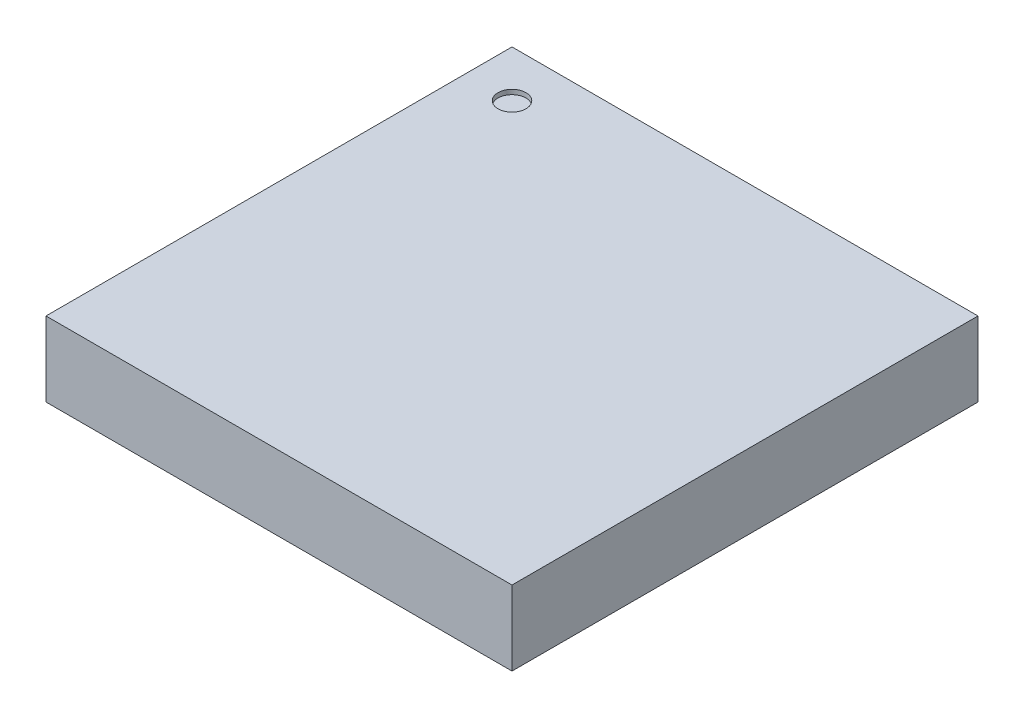
ISO-10303-21;
HEADER;
FILE_DESCRIPTION(('STEP AP214'),'2;1');
FILE_NAME('part.step','',(''),(''),'','','');
FILE_SCHEMA(('AUTOMOTIVE_DESIGN { 1 0 10303 214 1 1 1 1 }'));
ENDSEC;
DATA;
#1=APPLICATION_CONTEXT('core data for automotive mechanical design processes');
#2=APPLICATION_PROTOCOL_DEFINITION('international standard','automotive_design',2000,#1);
#3=PRODUCT_CONTEXT('',#1,'mechanical');
#4=PRODUCT('Part','Part','',(#3));
#5=PRODUCT_RELATED_PRODUCT_CATEGORY('part','',(#4));
#6=PRODUCT_DEFINITION_FORMATION('','',#4);
#7=PRODUCT_DEFINITION_CONTEXT('part definition',#1,'design');
#8=PRODUCT_DEFINITION('design','',#6,#7);
#9=PRODUCT_DEFINITION_SHAPE('','',#8);
#10=(LENGTH_UNIT() NAMED_UNIT(*) SI_UNIT(.MILLI.,.METRE.));
#11=(NAMED_UNIT(*) PLANE_ANGLE_UNIT() SI_UNIT($,.RADIAN.));
#12=(NAMED_UNIT(*) SI_UNIT($,.STERADIAN.) SOLID_ANGLE_UNIT());
#13=UNCERTAINTY_MEASURE_WITH_UNIT(LENGTH_MEASURE(1.E-05),#10,'distance_accuracy_value','');
#14=(GEOMETRIC_REPRESENTATION_CONTEXT(3) GLOBAL_UNCERTAINTY_ASSIGNED_CONTEXT((#13)) GLOBAL_UNIT_ASSIGNED_CONTEXT((#10,
#11,#12)) REPRESENTATION_CONTEXT('',''));
#15=CARTESIAN_POINT('',(0.,0.,0.));
#16=DIRECTION('',(0.,0.,1.));
#17=DIRECTION('',(1.,0.,0.));
#18=AXIS2_PLACEMENT_3D('',#15,#16,#17);
#19=CARTESIAN_POINT('',(-2.,0.8,-2.));
#20=DIRECTION('',(0.,1.,0.));
#21=DIRECTION('',(0.,0.,1.));
#22=AXIS2_PLACEMENT_3D('',#19,#20,#21);
#23=PLANE('',#22);
#24=CARTESIAN_POINT('',(-2.,0.8,-2.));
#25=DIRECTION('',(0.,1.,0.));
#26=DIRECTION('',(0.,0.,1.));
#27=AXIS2_PLACEMENT_3D('',#24,#25,#26);
#28=CIRCLE('',#27,0.15);
#29=CARTESIAN_POINT('',(-2.,0.8,-1.85));
#30=VERTEX_POINT('',#29);
#31=EDGE_CURVE('E19',#30,#30,#28,.T.);
#32=ORIENTED_EDGE('',*,*,#31,.T.);
#33=EDGE_LOOP('',(#32));
#34=FACE_BOUND('',#33,.T.);
#35=ADVANCED_FACE('F16',(#34),#23,.T.);
#36=CARTESIAN_POINT('',(-2.,0.8,-2.));
#37=DIRECTION('',(0.,1.,0.));
#38=DIRECTION('',(0.,0.,1.));
#39=AXIS2_PLACEMENT_3D('',#36,#37,#38);
#40=CYLINDRICAL_SURFACE('',#39,0.15);
#41=ORIENTED_EDGE('',*,*,#31,.F.);
#42=EDGE_LOOP('',(#41));
#43=FACE_BOUND('',#42,.T.);
#44=CARTESIAN_POINT('',(-2.,0.85,-2.));
#45=DIRECTION('',(0.,1.,0.));
#46=DIRECTION('',(0.,0.,1.));
#47=AXIS2_PLACEMENT_3D('',#44,#45,#46);
#48=CIRCLE('',#47,0.15);
#49=CARTESIAN_POINT('',(-2.,0.85,-1.85));
#50=VERTEX_POINT('',#49);
#51=EDGE_CURVE('E68',#50,#50,#48,.T.);
#52=ORIENTED_EDGE('',*,*,#51,.T.);
#53=EDGE_LOOP('',(#52));
#54=FACE_BOUND('',#53,.T.);
#55=ADVANCED_FACE('F89',(#43,#54),#40,.F.);
#56=CARTESIAN_POINT('',(2.5,0.85,-2.5));
#57=DIRECTION('',(0.,-1.,0.));
#58=DIRECTION('',(0.,0.,-1.));
#59=AXIS2_PLACEMENT_3D('',#56,#57,#58);
#60=PLANE('',#59);
#61=DIRECTION('',(-1.,0.,0.));
#62=VECTOR('',#61,1.);
#63=CARTESIAN_POINT('',(-2.5,0.85,2.5));
#64=LINE('',#63,#62);
#65=CARTESIAN_POINT('',(-2.5,0.85,2.5));
#66=VERTEX_POINT('',#65);
#67=CARTESIAN_POINT('',(2.5,0.85,2.5));
#68=VERTEX_POINT('',#67);
#69=EDGE_CURVE('E54',#66,#68,#64,.F.);
#70=ORIENTED_EDGE('',*,*,#69,.T.);
#71=DIRECTION('',(0.,0.,1.));
#72=VECTOR('',#71,1.);
#73=CARTESIAN_POINT('',(2.5,0.85,2.5));
#74=LINE('',#73,#72);
#75=CARTESIAN_POINT('',(2.5,0.85,-2.5));
#76=VERTEX_POINT('',#75);
#77=EDGE_CURVE('E59',#68,#76,#74,.F.);
#78=ORIENTED_EDGE('',*,*,#77,.T.);
#79=DIRECTION('',(1.,0.,0.));
#80=VECTOR('',#79,1.);
#81=CARTESIAN_POINT('',(-2.5,0.85,-2.5));
#82=LINE('',#81,#80);
#83=CARTESIAN_POINT('',(-2.5,0.85,-2.5));
#84=VERTEX_POINT('',#83);
#85=EDGE_CURVE('E208',#76,#84,#82,.F.);
#86=ORIENTED_EDGE('',*,*,#85,.T.);
#87=DIRECTION('',(0.,0.,-1.));
#88=VECTOR('',#87,1.);
#89=CARTESIAN_POINT('',(-2.5,0.85,2.5));
#90=LINE('',#89,#88);
#91=EDGE_CURVE('E72',#84,#66,#90,.F.);
#92=ORIENTED_EDGE('',*,*,#91,.T.);
#93=EDGE_LOOP('',(#70,#78,#86,#92));
#94=FACE_BOUND('',#93,.T.);
#95=ORIENTED_EDGE('',*,*,#51,.F.);
#96=EDGE_LOOP('',(#95));
#97=FACE_BOUND('',#96,.T.);
#98=ADVANCED_FACE('F70',(#94,#97),#60,.F.);
#99=CARTESIAN_POINT('',(2.5,0.85,2.5));
#100=DIRECTION('',(-1.,0.,0.));
#101=DIRECTION('',(0.,0.,1.));
#102=AXIS2_PLACEMENT_3D('',#99,#100,#101);
#103=PLANE('',#102);
#104=DIRECTION('',(0.,1.,0.));
#105=VECTOR('',#104,1.);
#106=CARTESIAN_POINT('',(2.5,0.85,2.5));
#107=LINE('',#106,#105);
#108=CARTESIAN_POINT('',(2.5,0.05,2.5));
#109=VERTEX_POINT('',#108);
#110=EDGE_CURVE('E61',#68,#109,#107,.F.);
#111=ORIENTED_EDGE('',*,*,#110,.T.);
#112=DIRECTION('',(0.,0.,-1.));
#113=VECTOR('',#112,1.);
#114=CARTESIAN_POINT('',(2.5,0.05,-2.5));
#115=LINE('',#114,#113);
#116=CARTESIAN_POINT('',(2.5,0.05,-2.5));
#117=VERTEX_POINT('',#116);
#118=EDGE_CURVE('E204',#117,#109,#115,.F.);
#119=ORIENTED_EDGE('',*,*,#118,.F.);
#120=DIRECTION('',(0.,1.,0.));
#121=VECTOR('',#120,1.);
#122=CARTESIAN_POINT('',(2.5,0.85,-2.5));
#123=LINE('',#122,#121);
#124=EDGE_CURVE('E64',#117,#76,#123,.T.);
#125=ORIENTED_EDGE('',*,*,#124,.T.);
#126=ORIENTED_EDGE('',*,*,#77,.F.);
#127=EDGE_LOOP('',(#111,#119,#125,#126));
#128=FACE_BOUND('',#127,.T.);
#129=ADVANCED_FACE('F60',(#128),#103,.F.);
#130=CARTESIAN_POINT('',(-2.5,0.85,2.5));
#131=DIRECTION('',(0.,0.,-1.));
#132=DIRECTION('',(-1.,0.,0.));
#133=AXIS2_PLACEMENT_3D('',#130,#131,#132);
#134=PLANE('',#133);
#135=DIRECTION('',(0.,1.,0.));
#136=VECTOR('',#135,1.);
#137=CARTESIAN_POINT('',(-2.5,0.85,2.5));
#138=LINE('',#137,#136);
#139=CARTESIAN_POINT('',(-2.5,0.05,2.5));
#140=VERTEX_POINT('',#139);
#141=EDGE_CURVE('E74',#66,#140,#138,.F.);
#142=ORIENTED_EDGE('',*,*,#141,.T.);
#143=DIRECTION('',(1.,0.,0.));
#144=VECTOR('',#143,1.);
#145=CARTESIAN_POINT('',(2.5,0.05,2.5));
#146=LINE('',#145,#144);
#147=EDGE_CURVE('E78',#109,#140,#146,.F.);
#148=ORIENTED_EDGE('',*,*,#147,.F.);
#149=ORIENTED_EDGE('',*,*,#110,.F.);
#150=ORIENTED_EDGE('',*,*,#69,.F.);
#151=EDGE_LOOP('',(#142,#148,#149,#150));
#152=FACE_BOUND('',#151,.T.);
#153=ADVANCED_FACE('F76',(#152),#134,.F.);
#154=CARTESIAN_POINT('',(-2.5,0.85,2.5));
#155=DIRECTION('',(1.,0.,0.));
#156=DIRECTION('',(0.,0.,-1.));
#157=AXIS2_PLACEMENT_3D('',#154,#155,#156);
#158=PLANE('',#157);
#159=DIRECTION('',(0.,1.,0.));
#160=VECTOR('',#159,1.);
#161=CARTESIAN_POINT('',(-2.5,0.85,-2.5));
#162=LINE('',#161,#160);
#163=CARTESIAN_POINT('',(-2.5,0.05,-2.5));
#164=VERTEX_POINT('',#163);
#165=EDGE_CURVE('E34',#84,#164,#162,.F.);
#166=ORIENTED_EDGE('',*,*,#165,.T.);
#167=DIRECTION('',(0.,0.,-1.));
#168=VECTOR('',#167,1.);
#169=CARTESIAN_POINT('',(-2.5,0.05,-2.5));
#170=LINE('',#169,#168);
#171=EDGE_CURVE('E25',#140,#164,#170,.T.);
#172=ORIENTED_EDGE('',*,*,#171,.F.);
#173=ORIENTED_EDGE('',*,*,#141,.F.);
#174=ORIENTED_EDGE('',*,*,#91,.F.);
#175=EDGE_LOOP('',(#166,#172,#173,#174));
#176=FACE_BOUND('',#175,.T.);
#177=ADVANCED_FACE('F105',(#176),#158,.F.);
#178=CARTESIAN_POINT('',(-2.5,0.85,-2.5));
#179=DIRECTION('',(0.,0.,1.));
#180=DIRECTION('',(1.,0.,0.));
#181=AXIS2_PLACEMENT_3D('',#178,#179,#180);
#182=PLANE('',#181);
#183=ORIENTED_EDGE('',*,*,#124,.F.);
#184=DIRECTION('',(1.,0.,0.));
#185=VECTOR('',#184,1.);
#186=CARTESIAN_POINT('',(2.5,0.05,-2.5));
#187=LINE('',#186,#185);
#188=EDGE_CURVE('E11',#164,#117,#187,.T.);
#189=ORIENTED_EDGE('',*,*,#188,.F.);
#190=ORIENTED_EDGE('',*,*,#165,.F.);
#191=ORIENTED_EDGE('',*,*,#85,.F.);
#192=EDGE_LOOP('',(#183,#189,#190,#191));
#193=FACE_BOUND('',#192,.T.);
#194=ADVANCED_FACE('F99',(#193),#182,.F.);
#195=CARTESIAN_POINT('',(2.5,0.05,-2.5));
#196=DIRECTION('',(0.,-1.,0.));
#197=DIRECTION('',(0.,0.,-1.));
#198=AXIS2_PLACEMENT_3D('',#195,#196,#197);
#199=PLANE('',#198);
#200=ORIENTED_EDGE('',*,*,#171,.T.);
#201=ORIENTED_EDGE('',*,*,#188,.T.);
#202=ORIENTED_EDGE('',*,*,#118,.T.);
#203=ORIENTED_EDGE('',*,*,#147,.T.);
#204=EDGE_LOOP('',(#200,#201,#202,#203));
#205=FACE_BOUND('',#204,.T.);
#206=ADVANCED_FACE('F97',(#205),#199,.T.);
#207=CLOSED_SHELL('',(#35,#55,#98,#129,#153,#177,#194,#206));
#208=MANIFOLD_SOLID_BREP('B1',#207);
#209=ADVANCED_BREP_SHAPE_REPRESENTATION('',(#18,#208),#14);
#210=SHAPE_DEFINITION_REPRESENTATION(#9,#209);
ENDSEC;
END-ISO-10303-21;
